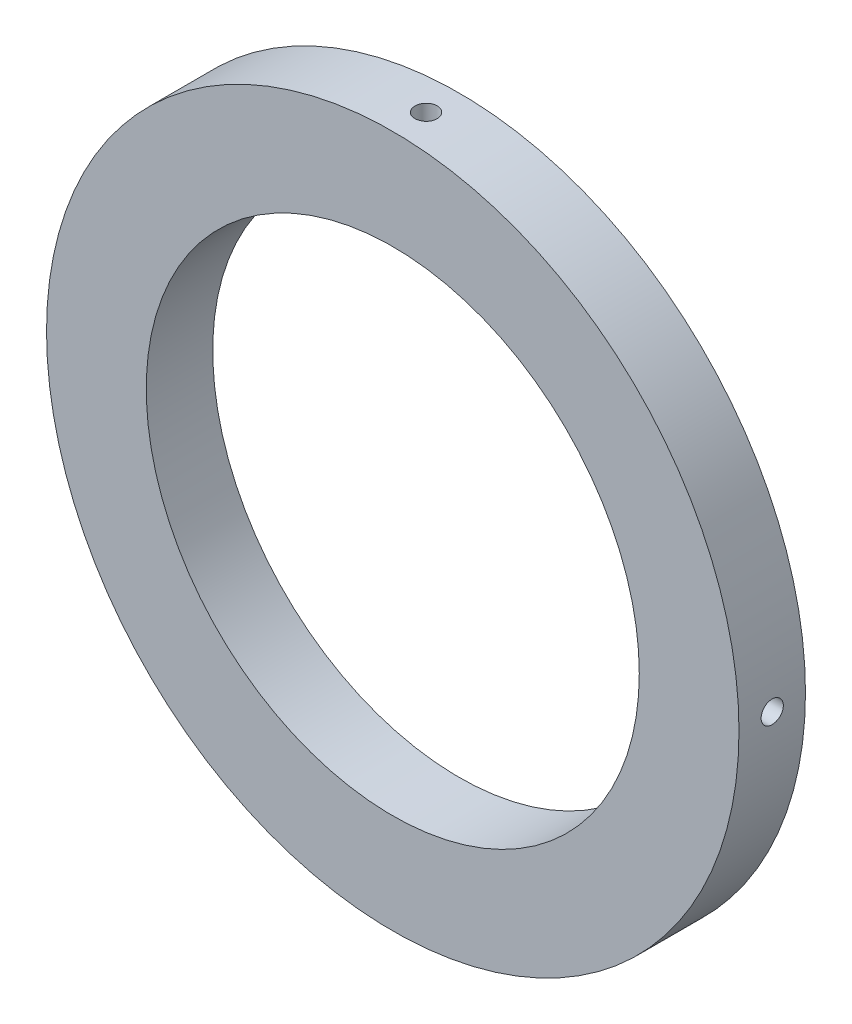
ISO-10303-21;
HEADER;
FILE_DESCRIPTION(('STEP AP214'),'2;1');
FILE_NAME('part.step','',(''),(''),'','','');
FILE_SCHEMA(('AUTOMOTIVE_DESIGN { 1 0 10303 214 1 1 1 1 }'));
ENDSEC;
DATA;
#1=APPLICATION_CONTEXT('core data for automotive mechanical design processes');
#2=APPLICATION_PROTOCOL_DEFINITION('international standard','automotive_design',2000,#1);
#3=PRODUCT_CONTEXT('',#1,'mechanical');
#4=PRODUCT('Part','Part','',(#3));
#5=PRODUCT_RELATED_PRODUCT_CATEGORY('part','',(#4));
#6=PRODUCT_DEFINITION_FORMATION('','',#4);
#7=PRODUCT_DEFINITION_CONTEXT('part definition',#1,'design');
#8=PRODUCT_DEFINITION('design','',#6,#7);
#9=PRODUCT_DEFINITION_SHAPE('','',#8);
#10=(LENGTH_UNIT() NAMED_UNIT(*) SI_UNIT(.MILLI.,.METRE.));
#11=(NAMED_UNIT(*) PLANE_ANGLE_UNIT() SI_UNIT($,.RADIAN.));
#12=(NAMED_UNIT(*) SI_UNIT($,.STERADIAN.) SOLID_ANGLE_UNIT());
#13=UNCERTAINTY_MEASURE_WITH_UNIT(LENGTH_MEASURE(1.E-05),#10,'distance_accuracy_value','');
#14=(GEOMETRIC_REPRESENTATION_CONTEXT(3) GLOBAL_UNCERTAINTY_ASSIGNED_CONTEXT((#13)) GLOBAL_UNIT_ASSIGNED_CONTEXT((#10,
#11,#12)) REPRESENTATION_CONTEXT('',''));
#15=CARTESIAN_POINT('',(0.,0.,0.));
#16=DIRECTION('',(0.,0.,1.));
#17=DIRECTION('',(1.,0.,0.));
#18=AXIS2_PLACEMENT_3D('',#15,#16,#17);
#19=CARTESIAN_POINT('',(0.,0.,6.));
#20=DIRECTION('',(0.,0.,-1.));
#21=DIRECTION('',(-1.,0.,0.));
#22=AXIS2_PLACEMENT_3D('',#19,#20,#21);
#23=CYLINDRICAL_SURFACE('',#22,62.5);
#24=CARTESIAN_POINT('',(-62.5,0.,2.));
#25=CARTESIAN_POINT('',(-62.4999995691048,-0.11231003332482,1.9999950289741));
#26=CARTESIAN_POINT('',(-62.4996940278379,-0.224700769959252,1.99050808679491));
#27=CARTESIAN_POINT('',(-62.4985045360078,-0.446384828450461,1.95279562582615));
#28=CARTESIAN_POINT('',(-62.4976198952782,-0.555674291875496,1.92454774731149));
#29=CARTESIAN_POINT('',(-62.4953723833313,-0.76791221481031,1.85012028682134));
#30=CARTESIAN_POINT('',(-62.4940097468506,-0.870863757661421,1.80394950533588));
#31=CARTESIAN_POINT('',(-62.4909599274924,-1.06752616621898,1.69499955155458));
#32=CARTESIAN_POINT('',(-62.4892728236653,-1.16123927430315,1.63222442320268));
#33=CARTESIAN_POINT('',(-62.4857630801216,-1.33684016007617,1.4918112906154));
#34=CARTESIAN_POINT('',(-62.4839403832154,-1.41872290470148,1.41416699297466));
#35=CARTESIAN_POINT('',(-62.4803653858262,-1.56829629148627,1.24623078210407));
#36=CARTESIAN_POINT('',(-62.4786130881545,-1.63598636731638,1.15593836441663));
#37=CARTESIAN_POINT('',(-62.4753761886423,-1.75526175390508,0.965249081508573));
#38=CARTESIAN_POINT('',(-62.4738916393946,-1.80684390209016,0.864850237138202));
#39=CARTESIAN_POINT('',(-62.4713581958304,-1.89241867681929,0.656812134178371));
#40=CARTESIAN_POINT('',(-62.470309299646,-1.92641137878248,0.549172906636092));
#41=CARTESIAN_POINT('',(-62.4687658666881,-1.97583112734589,0.329748833268305));
#42=CARTESIAN_POINT('',(-62.4682711387342,-1.99126457676676,0.217965430883288));
#43=CARTESIAN_POINT('',(-62.4678912506535,-2.00314744915503,-0.00660657213354373));
#44=CARTESIAN_POINT('',(-62.4680060879093,-1.99959695363795,-0.119395168447062));
#45=CARTESIAN_POINT('',(-62.4688322022814,-1.97361812403031,-0.3427324635363));
#46=CARTESIAN_POINT('',(-62.4695432607447,-1.95119671048448,-0.453281968237548));
#47=CARTESIAN_POINT('',(-62.4714813170102,-1.88812321347998,-0.669047092889274));
#48=CARTESIAN_POINT('',(-62.4727083160294,-1.84747108701891,-0.774262700257559));
#49=CARTESIAN_POINT('',(-62.4755401891637,-1.74908219078789,-0.9763956103056));
#50=CARTESIAN_POINT('',(-62.4771451333974,-1.69134225027881,-1.07331136859498));
#51=CARTESIAN_POINT('',(-62.4805519008691,-1.56041910396509,-1.25607655423932));
#52=CARTESIAN_POINT('',(-62.4823537246298,-1.48723585715829,-1.34192595221199));
#53=CARTESIAN_POINT('',(-62.4859521079271,-1.3274643627619,-1.50016177945304));
#54=CARTESIAN_POINT('',(-62.4877486647386,-1.24087011489895,-1.57254215041678));
#55=CARTESIAN_POINT('',(-62.4911332105912,-1.05675587699624,-1.70173865632043));
#56=CARTESIAN_POINT('',(-62.4927211995972,-0.959235885128259,-1.75855478865595));
#57=CARTESIAN_POINT('',(-62.4955096291705,-0.756035024789911,-1.8550093391255));
#58=CARTESIAN_POINT('',(-62.4967100654035,-0.650354065067295,-1.89464756515117));
#59=CARTESIAN_POINT('',(-62.4985880024256,-0.433832697452574,-1.9556172392457));
#60=CARTESIAN_POINT('',(-62.4992655048312,-0.32299230550992,-1.97694874390251));
#61=CARTESIAN_POINT('',(-62.5000209974192,-0.0993510779584291,-2.00069202279605));
#62=CARTESIAN_POINT('',(-62.5000992532154,0.0134488668623008,-2.00311217942155));
#63=CARTESIAN_POINT('',(-62.4996481351289,0.237853441492163,-1.98898590928016));
#64=CARTESIAN_POINT('',(-62.4991187620512,0.349458072884912,-1.97243950764435));
#65=CARTESIAN_POINT('',(-62.4975122155884,0.568280581329863,-1.92085675170576));
#66=CARTESIAN_POINT('',(-62.4964351550129,0.675499356844618,-1.88582420502076));
#67=CARTESIAN_POINT('',(-62.4938545937676,0.882534185428098,-1.79826747151954));
#68=CARTESIAN_POINT('',(-62.4923510921167,0.982350221463125,-1.7457432444565));
#69=CARTESIAN_POINT('',(-62.489086340168,1.17178472574769,-1.62467255048254));
#70=CARTESIAN_POINT('',(-62.4873249992276,1.26139958803169,-1.55612044393968));
#71=CARTESIAN_POINT('',(-62.4837433630355,1.42785168383287,-1.40494821395652));
#72=CARTESIAN_POINT('',(-62.4819230676156,1.50468888089511,-1.32232805038111));
#73=CARTESIAN_POINT('',(-62.4784279707888,1.64343252244242,-1.14532906345293));
#74=CARTESIAN_POINT('',(-62.4767532222403,1.70533355693563,-1.05094599820289));
#75=CARTESIAN_POINT('',(-62.4737388738995,1.81241074122226,-0.853122029147493));
#76=CARTESIAN_POINT('',(-62.4723992732974,1.85758693143224,-0.749681147231634));
#77=CARTESIAN_POINT('',(-62.4702066376182,1.92992256506237,-0.536698195906036));
#78=CARTESIAN_POINT('',(-62.4693535081147,1.95708550510527,-0.427157315068665));
#79=CARTESIAN_POINT('',(-62.4682297389501,1.99263504229854,-0.205067010164371));
#80=CARTESIAN_POINT('',(-62.4679590985605,2.00102166293039,-0.092517589860075));
#81=CARTESIAN_POINT('',(-62.4680308558449,1.99878009628648,0.132340817523504));
#82=CARTESIAN_POINT('',(-62.4683729785305,1.9881604384219,0.244649889819214));
#83=CARTESIAN_POINT('',(-62.4696311162344,1.94822531924438,0.465890163127914));
#84=CARTESIAN_POINT('',(-62.4705471323877,1.91890982095921,0.574821357460483));
#85=CARTESIAN_POINT('',(-62.4728497507852,1.8424164469434,0.786216741342344));
#86=CARTESIAN_POINT('',(-62.4742363606753,1.79523828098828,0.88868082578542));
#87=CARTESIAN_POINT('',(-62.4773237964511,1.6843614549507,1.08423216714658));
#88=CARTESIAN_POINT('',(-62.479024611107,1.62066338525739,1.1773197589972));
#89=CARTESIAN_POINT('',(-62.4825495142681,1.47852878356106,1.35151552679399));
#90=CARTESIAN_POINT('',(-62.4843736447435,1.40008721730535,1.4326195939504));
#91=CARTESIAN_POINT('',(-62.4879395737552,1.23067860467564,1.58053011850308));
#92=CARTESIAN_POINT('',(-62.4896813518036,1.13970846321673,1.64733303246385));
#93=CARTESIAN_POINT('',(-62.4928868889546,0.947786672192984,1.76475783281649));
#94=CARTESIAN_POINT('',(-62.4943504604447,0.846828356237342,1.81536881555901));
#95=CARTESIAN_POINT('',(-62.4968313107122,0.637920632646016,1.89886333802007));
#96=CARTESIAN_POINT('',(-62.4978491210192,0.529979728435139,1.93176800168585));
#97=CARTESIAN_POINT('',(-62.4990519563076,0.351131529826547,1.97020270096496));
#98=CARTESIAN_POINT('',(-62.4994059285874,0.281384922933388,1.98136261230068));
#99=CARTESIAN_POINT('',(-62.4998800857657,0.141102830908638,1.99626282228382));
#100=CARTESIAN_POINT('',(-62.5000002707428,0.0705673460423312,2.00000312342624));
#101=CARTESIAN_POINT('',(-62.5,0.,2.));
#102=B_SPLINE_CURVE_WITH_KNOTS('',3,(#24,#25,#26,#27,#28,#29,#30,#31,#32,#33,#34,#35,#36,#37,
#38,#39,#40,#41,#42,#43,#44,#45,#46,#47,#48,#49,#50,#51,#52,#53,#54,#55,#56,#57,#58,#59,#60,#61,
#62,#63,#64,#65,#66,#67,#68,#69,#70,#71,#72,#73,#74,#75,#76,#77,#78,#79,#80,#81,#82,#83,#84,#85,
#86,#87,#88,#89,#90,#91,#92,#93,#94,#95,#96,#97,#98,#99,#100,#101),.UNSPECIFIED.,.T.,.F.,(4,2,2,
2,2,2,2,2,2,2,2,2,2,2,2,2,2,2,2,2,2,2,2,2,2,2,2,2,2,2,2,2,2,2,2,2,2,2,4),(0.,0.336672518670816,
0.673747013347549,1.01065620689366,1.34748342254514,1.68445351733391,2.02143705566592,
2.35848671461609,2.69553492836994,3.03246682930634,3.36939728348592,3.70620422874169,
4.04301196845831,4.37988224395508,4.71675341385757,5.05377574249107,5.39079812751915,
5.72782428152482,6.0648493937443,6.40172511228489,6.73860038445866,7.07540629701787,
7.41221298454317,7.74913836100434,8.08606469870433,8.42311289111117,8.76016026901621,
9.09714220216487,9.43412371388713,9.77095403697969,10.1077850261783,10.4446214882882,
10.7814459141778,11.1183855603567,11.4554085946085,11.792658104853,12.1295043734805,
12.3410446376387,12.552584830662),.UNSPECIFIED.);
#103=CARTESIAN_POINT('',(-62.5,0.,2.));
#104=VERTEX_POINT('',#103);
#105=EDGE_CURVE('E34',#104,#104,#102,.T.);
#106=ORIENTED_EDGE('',*,*,#105,.T.);
#107=EDGE_LOOP('',(#106));
#108=FACE_BOUND('',#107,.T.);
#109=CARTESIAN_POINT('',(0.,-62.5,2.));
#110=CARTESIAN_POINT('',(0.11231003332482,-62.4999995691048,1.9999950289741));
#111=CARTESIAN_POINT('',(0.224700769959253,-62.4996940278379,1.99050808679491));
#112=CARTESIAN_POINT('',(0.446384828450461,-62.4985045360078,1.95279562582615));
#113=CARTESIAN_POINT('',(0.555674291875497,-62.4976198952782,1.92454774731149));
#114=CARTESIAN_POINT('',(0.76791221481031,-62.4953723833313,1.85012028682134));
#115=CARTESIAN_POINT('',(0.870863757661422,-62.4940097468506,1.80394950533588));
#116=CARTESIAN_POINT('',(1.06752616621898,-62.4909599274924,1.69499955155458));
#117=CARTESIAN_POINT('',(1.16123927430315,-62.4892728236653,1.63222442320268));
#118=CARTESIAN_POINT('',(1.33684016007617,-62.4857630801216,1.4918112906154));
#119=CARTESIAN_POINT('',(1.41872290470148,-62.4839403832154,1.41416699297466));
#120=CARTESIAN_POINT('',(1.56829629148627,-62.4803653858262,1.24623078210407));
#121=CARTESIAN_POINT('',(1.63598636731638,-62.4786130881545,1.15593836441663));
#122=CARTESIAN_POINT('',(1.75526175390508,-62.4753761886423,0.965249081508572));
#123=CARTESIAN_POINT('',(1.80684390209016,-62.4738916393946,0.864850237138202));
#124=CARTESIAN_POINT('',(1.8924186768193,-62.4713581958304,0.65681213417837));
#125=CARTESIAN_POINT('',(1.92641137878248,-62.470309299646,0.549172906636091));
#126=CARTESIAN_POINT('',(1.97583112734589,-62.4687658666881,0.329748833268303));
#127=CARTESIAN_POINT('',(1.99126457676676,-62.4682711387342,0.217965430883287));
#128=CARTESIAN_POINT('',(2.00314744915503,-62.4678912506536,-0.00660657213354471));
#129=CARTESIAN_POINT('',(1.99959695363795,-62.4680060879093,-0.119395168447063));
#130=CARTESIAN_POINT('',(1.97361812403031,-62.4688322022814,-0.3427324635363));
#131=CARTESIAN_POINT('',(1.95119671048448,-62.4695432607447,-0.453281968237548));
#132=CARTESIAN_POINT('',(1.88812321347998,-62.4714813170102,-0.669047092889274));
#133=CARTESIAN_POINT('',(1.84747108701891,-62.4727083160294,-0.77426270025756));
#134=CARTESIAN_POINT('',(1.74908219078789,-62.4755401891637,-0.9763956103056));
#135=CARTESIAN_POINT('',(1.69134225027881,-62.4771451333974,-1.07331136859498));
#136=CARTESIAN_POINT('',(1.56041910396509,-62.4805519008691,-1.25607655423932));
#137=CARTESIAN_POINT('',(1.48723585715829,-62.4823537246298,-1.34192595221199));
#138=CARTESIAN_POINT('',(1.3274643627619,-62.4859521079271,-1.50016177945304));
#139=CARTESIAN_POINT('',(1.24087011489895,-62.4877486647386,-1.57254215041678));
#140=CARTESIAN_POINT('',(1.05675587699624,-62.4911332105912,-1.70173865632043));
#141=CARTESIAN_POINT('',(0.959235885128259,-62.4927211995972,-1.75855478865595));
#142=CARTESIAN_POINT('',(0.756035024789911,-62.4955096291705,-1.8550093391255));
#143=CARTESIAN_POINT('',(0.650354065067294,-62.4967100654035,-1.89464756515117));
#144=CARTESIAN_POINT('',(0.433832697452573,-62.4985880024256,-1.9556172392457));
#145=CARTESIAN_POINT('',(0.322992305509919,-62.4992655048312,-1.97694874390251));
#146=CARTESIAN_POINT('',(0.099351077958428,-62.5000209974192,-2.00069202279605));
#147=CARTESIAN_POINT('',(-0.0134488668623019,-62.5000992532154,-2.00311217942155));
#148=CARTESIAN_POINT('',(-0.237853441492164,-62.4996481351289,-1.98898590928016));
#149=CARTESIAN_POINT('',(-0.349458072884913,-62.4991187620512,-1.97243950764436));
#150=CARTESIAN_POINT('',(-0.568280581329864,-62.4975122155884,-1.92085675170576));
#151=CARTESIAN_POINT('',(-0.675499356844619,-62.4964351550129,-1.88582420502076));
#152=CARTESIAN_POINT('',(-0.882534185428099,-62.4938545937676,-1.79826747151954));
#153=CARTESIAN_POINT('',(-0.982350221463126,-62.4923510921167,-1.7457432444565));
#154=CARTESIAN_POINT('',(-1.17178472574769,-62.489086340168,-1.62467255048254));
#155=CARTESIAN_POINT('',(-1.26139958803169,-62.4873249992276,-1.55612044393968));
#156=CARTESIAN_POINT('',(-1.42785168383287,-62.4837433630355,-1.40494821395652));
#157=CARTESIAN_POINT('',(-1.50468888089512,-62.4819230676156,-1.32232805038111));
#158=CARTESIAN_POINT('',(-1.64343252244242,-62.4784279707888,-1.14532906345293));
#159=CARTESIAN_POINT('',(-1.70533355693563,-62.4767532222403,-1.05094599820288));
#160=CARTESIAN_POINT('',(-1.81241074122226,-62.4737388738995,-0.853122029147492));
#161=CARTESIAN_POINT('',(-1.85758693143224,-62.4723992732974,-0.749681147231633));
#162=CARTESIAN_POINT('',(-1.92992256506237,-62.4702066376182,-0.536698195906035));
#163=CARTESIAN_POINT('',(-1.95708550510527,-62.4693535081147,-0.427157315068664));
#164=CARTESIAN_POINT('',(-1.99263504229854,-62.4682297389501,-0.20506701016437));
#165=CARTESIAN_POINT('',(-2.00102166293039,-62.4679590985605,-0.0925175898600738));
#166=CARTESIAN_POINT('',(-1.99878009628648,-62.4680308558449,0.132340817523506));
#167=CARTESIAN_POINT('',(-1.9881604384219,-62.4683729785305,0.244649889819216));
#168=CARTESIAN_POINT('',(-1.94822531924438,-62.4696311162344,0.465890163127916));
#169=CARTESIAN_POINT('',(-1.91890982095921,-62.4705471323877,0.574821357460485));
#170=CARTESIAN_POINT('',(-1.8424164469434,-62.4728497507852,0.786216741342345));
#171=CARTESIAN_POINT('',(-1.79523828098828,-62.4742363606753,0.888680825785421));
#172=CARTESIAN_POINT('',(-1.6843614549507,-62.4773237964511,1.08423216714658));
#173=CARTESIAN_POINT('',(-1.62066338525739,-62.479024611107,1.1773197589972));
#174=CARTESIAN_POINT('',(-1.47852878356106,-62.4825495142681,1.35151552679399));
#175=CARTESIAN_POINT('',(-1.40008721730535,-62.4843736447435,1.4326195939504));
#176=CARTESIAN_POINT('',(-1.23067860467564,-62.4879395737552,1.58053011850309));
#177=CARTESIAN_POINT('',(-1.13970846321673,-62.4896813518036,1.64733303246385));
#178=CARTESIAN_POINT('',(-0.947786672192983,-62.4928868889546,1.76475783281649));
#179=CARTESIAN_POINT('',(-0.846828356237341,-62.4943504604447,1.81536881555901));
#180=CARTESIAN_POINT('',(-0.637920632646014,-62.4968313107122,1.89886333802007));
#181=CARTESIAN_POINT('',(-0.529979728435138,-62.4978491210192,1.93176800168585));
#182=CARTESIAN_POINT('',(-0.351131529826545,-62.4990519563076,1.97020270096496));
#183=CARTESIAN_POINT('',(-0.281384922933387,-62.4994059285874,1.98136261230068));
#184=CARTESIAN_POINT('',(-0.141102830908637,-62.4998800857657,1.99626282228382));
#185=CARTESIAN_POINT('',(-0.0705673460423306,-62.5000002707428,2.00000312342624));
#186=CARTESIAN_POINT('',(0.,-62.5,2.));
#187=B_SPLINE_CURVE_WITH_KNOTS('',3,(#109,#110,#111,#112,#113,#114,#115,#116,#117,#118,#119,
#120,#121,#122,#123,#124,#125,#126,#127,#128,#129,#130,#131,#132,#133,#134,#135,#136,#137,#138,
#139,#140,#141,#142,#143,#144,#145,#146,#147,#148,#149,#150,#151,#152,#153,#154,#155,#156,#157,
#158,#159,#160,#161,#162,#163,#164,#165,#166,#167,#168,#169,#170,#171,#172,#173,#174,#175,#176,
#177,#178,#179,#180,#181,#182,#183,#184,#185,#186),.UNSPECIFIED.,.T.,.F.,(4,2,2,2,2,2,2,2,2,2,2,
2,2,2,2,2,2,2,2,2,2,2,2,2,2,2,2,2,2,2,2,2,2,2,2,2,2,2,4),(0.,0.336672518670817,
0.673747013347549,1.01065620689366,1.34748342254514,1.68445351733391,2.02143705566592,
2.35848671461609,2.69553492836994,3.03246682930634,3.36939728348592,3.70620422874169,
4.04301196845831,4.37988224395508,4.71675341385757,5.05377574249107,5.39079812751915,
5.72782428152482,6.06484939374431,6.40172511228489,6.73860038445866,7.07540629701787,
7.41221298454317,7.74913836100434,8.08606469870433,8.42311289111117,8.76016026901621,
9.09714220216487,9.43412371388713,9.7709540369797,10.1077850261783,10.4446214882882,
10.7814459141778,11.1183855603567,11.4554085946085,11.7926581048531,12.1295043734805,
12.3410446376387,12.552584830662),.UNSPECIFIED.);
#188=CARTESIAN_POINT('',(0.,-62.5,2.));
#189=VERTEX_POINT('',#188);
#190=EDGE_CURVE('E61',#189,#189,#187,.T.);
#191=ORIENTED_EDGE('',*,*,#190,.T.);
#192=EDGE_LOOP('',(#191));
#193=FACE_BOUND('',#192,.T.);
#194=CARTESIAN_POINT('',(0.,0.,6.));
#195=DIRECTION('',(0.,0.,1.));
#196=DIRECTION('',(1.,0.,0.));
#197=AXIS2_PLACEMENT_3D('',#194,#195,#196);
#198=CIRCLE('',#197,62.5);
#199=CARTESIAN_POINT('',(62.5,0.,6.));
#200=VERTEX_POINT('',#199);
#201=EDGE_CURVE('E10',#200,#200,#198,.T.);
#202=ORIENTED_EDGE('',*,*,#201,.F.);
#203=EDGE_LOOP('',(#202));
#204=FACE_BOUND('',#203,.T.);
#205=CARTESIAN_POINT('',(0.,0.,-6.));
#206=DIRECTION('',(0.,0.,1.));
#207=DIRECTION('',(1.,0.,0.));
#208=AXIS2_PLACEMENT_3D('',#205,#206,#207);
#209=CIRCLE('',#208,62.5);
#210=CARTESIAN_POINT('',(62.5,0.,-6.));
#211=VERTEX_POINT('',#210);
#212=EDGE_CURVE('E42',#211,#211,#209,.T.);
#213=ORIENTED_EDGE('',*,*,#212,.T.);
#214=EDGE_LOOP('',(#213));
#215=FACE_BOUND('',#214,.T.);
#216=CARTESIAN_POINT('',(0.,62.5,-2.));
#217=CARTESIAN_POINT('',(-0.11231003332482,62.4999995691048,-1.9999950289741));
#218=CARTESIAN_POINT('',(-0.224700769959253,62.4996940278379,-1.99050808679491));
#219=CARTESIAN_POINT('',(-0.446384828450461,62.4985045360078,-1.95279562582615));
#220=CARTESIAN_POINT('',(-0.555674291875497,62.4976198952782,-1.92454774731149));
#221=CARTESIAN_POINT('',(-0.76791221481031,62.4953723833313,-1.85012028682134));
#222=CARTESIAN_POINT('',(-0.870863757661422,62.4940097468506,-1.80394950533588));
#223=CARTESIAN_POINT('',(-1.06752616621898,62.4909599274924,-1.69499955155458));
#224=CARTESIAN_POINT('',(-1.16123927430315,62.4892728236653,-1.63222442320268));
#225=CARTESIAN_POINT('',(-1.33684016007617,62.4857630801216,-1.4918112906154));
#226=CARTESIAN_POINT('',(-1.41872290470148,62.4839403832154,-1.41416699297466));
#227=CARTESIAN_POINT('',(-1.56829629148627,62.4803653858262,-1.24623078210407));
#228=CARTESIAN_POINT('',(-1.63598636731638,62.4786130881545,-1.15593836441663));
#229=CARTESIAN_POINT('',(-1.75526175390508,62.4753761886423,-0.965249081508572));
#230=CARTESIAN_POINT('',(-1.80684390209016,62.4738916393946,-0.864850237138202));
#231=CARTESIAN_POINT('',(-1.8924186768193,62.4713581958304,-0.65681213417837));
#232=CARTESIAN_POINT('',(-1.92641137878248,62.470309299646,-0.549172906636091));
#233=CARTESIAN_POINT('',(-1.97583112734589,62.4687658666881,-0.329748833268303));
#234=CARTESIAN_POINT('',(-1.99126457676676,62.4682711387342,-0.217965430883287));
#235=CARTESIAN_POINT('',(-2.00314744915503,62.4678912506536,0.00660657213354471));
#236=CARTESIAN_POINT('',(-1.99959695363795,62.4680060879093,0.119395168447063));
#237=CARTESIAN_POINT('',(-1.97361812403031,62.4688322022814,0.3427324635363));
#238=CARTESIAN_POINT('',(-1.95119671048448,62.4695432607447,0.453281968237548));
#239=CARTESIAN_POINT('',(-1.88812321347998,62.4714813170102,0.669047092889274));
#240=CARTESIAN_POINT('',(-1.84747108701891,62.4727083160294,0.77426270025756));
#241=CARTESIAN_POINT('',(-1.74908219078789,62.4755401891637,0.9763956103056));
#242=CARTESIAN_POINT('',(-1.69134225027881,62.4771451333974,1.07331136859498));
#243=CARTESIAN_POINT('',(-1.56041910396509,62.4805519008691,1.25607655423932));
#244=CARTESIAN_POINT('',(-1.48723585715829,62.4823537246298,1.34192595221199));
#245=CARTESIAN_POINT('',(-1.3274643627619,62.4859521079271,1.50016177945304));
#246=CARTESIAN_POINT('',(-1.24087011489895,62.4877486647386,1.57254215041678));
#247=CARTESIAN_POINT('',(-1.05675587699624,62.4911332105912,1.70173865632043));
#248=CARTESIAN_POINT('',(-0.959235885128259,62.4927211995972,1.75855478865595));
#249=CARTESIAN_POINT('',(-0.756035024789911,62.4955096291705,1.8550093391255));
#250=CARTESIAN_POINT('',(-0.650354065067294,62.4967100654035,1.89464756515117));
#251=CARTESIAN_POINT('',(-0.433832697452573,62.4985880024256,1.9556172392457));
#252=CARTESIAN_POINT('',(-0.322992305509919,62.4992655048312,1.97694874390251));
#253=CARTESIAN_POINT('',(-0.099351077958428,62.5000209974192,2.00069202279605));
#254=CARTESIAN_POINT('',(0.0134488668623019,62.5000992532154,2.00311217942155));
#255=CARTESIAN_POINT('',(0.237853441492164,62.4996481351289,1.98898590928016));
#256=CARTESIAN_POINT('',(0.349458072884913,62.4991187620512,1.97243950764436));
#257=CARTESIAN_POINT('',(0.568280581329864,62.4975122155884,1.92085675170576));
#258=CARTESIAN_POINT('',(0.675499356844619,62.4964351550129,1.88582420502076));
#259=CARTESIAN_POINT('',(0.882534185428099,62.4938545937676,1.79826747151954));
#260=CARTESIAN_POINT('',(0.982350221463126,62.4923510921167,1.7457432444565));
#261=CARTESIAN_POINT('',(1.17178472574769,62.489086340168,1.62467255048254));
#262=CARTESIAN_POINT('',(1.26139958803169,62.4873249992276,1.55612044393968));
#263=CARTESIAN_POINT('',(1.42785168383287,62.4837433630355,1.40494821395652));
#264=CARTESIAN_POINT('',(1.50468888089512,62.4819230676156,1.32232805038111));
#265=CARTESIAN_POINT('',(1.64343252244242,62.4784279707888,1.14532906345293));
#266=CARTESIAN_POINT('',(1.70533355693563,62.4767532222403,1.05094599820288));
#267=CARTESIAN_POINT('',(1.81241074122226,62.4737388738995,0.853122029147492));
#268=CARTESIAN_POINT('',(1.85758693143224,62.4723992732974,0.749681147231633));
#269=CARTESIAN_POINT('',(1.92992256506237,62.4702066376182,0.536698195906035));
#270=CARTESIAN_POINT('',(1.95708550510527,62.4693535081147,0.427157315068664));
#271=CARTESIAN_POINT('',(1.99263504229854,62.4682297389501,0.20506701016437));
#272=CARTESIAN_POINT('',(2.00102166293039,62.4679590985605,0.0925175898600738));
#273=CARTESIAN_POINT('',(1.99878009628648,62.4680308558449,-0.132340817523506));
#274=CARTESIAN_POINT('',(1.9881604384219,62.4683729785305,-0.244649889819216));
#275=CARTESIAN_POINT('',(1.94822531924438,62.4696311162344,-0.465890163127916));
#276=CARTESIAN_POINT('',(1.91890982095921,62.4705471323877,-0.574821357460485));
#277=CARTESIAN_POINT('',(1.8424164469434,62.4728497507852,-0.786216741342345));
#278=CARTESIAN_POINT('',(1.79523828098828,62.4742363606753,-0.888680825785421));
#279=CARTESIAN_POINT('',(1.6843614549507,62.4773237964511,-1.08423216714658));
#280=CARTESIAN_POINT('',(1.62066338525739,62.479024611107,-1.1773197589972));
#281=CARTESIAN_POINT('',(1.47852878356106,62.4825495142681,-1.35151552679399));
#282=CARTESIAN_POINT('',(1.40008721730535,62.4843736447435,-1.4326195939504));
#283=CARTESIAN_POINT('',(1.23067860467564,62.4879395737552,-1.58053011850309));
#284=CARTESIAN_POINT('',(1.13970846321673,62.4896813518036,-1.64733303246385));
#285=CARTESIAN_POINT('',(0.947786672192983,62.4928868889546,-1.76475783281649));
#286=CARTESIAN_POINT('',(0.846828356237341,62.4943504604447,-1.81536881555901));
#287=CARTESIAN_POINT('',(0.637920632646014,62.4968313107122,-1.89886333802007));
#288=CARTESIAN_POINT('',(0.529979728435138,62.4978491210192,-1.93176800168585));
#289=CARTESIAN_POINT('',(0.351131529826545,62.4990519563076,-1.97020270096496));
#290=CARTESIAN_POINT('',(0.281384922933387,62.4994059285874,-1.98136261230068));
#291=CARTESIAN_POINT('',(0.141102830908637,62.4998800857657,-1.99626282228382));
#292=CARTESIAN_POINT('',(0.0705673460423306,62.5000002707428,-2.00000312342624));
#293=CARTESIAN_POINT('',(0.,62.5,-2.));
#294=B_SPLINE_CURVE_WITH_KNOTS('',3,(#216,#217,#218,#219,#220,#221,#222,#223,#224,#225,#226,
#227,#228,#229,#230,#231,#232,#233,#234,#235,#236,#237,#238,#239,#240,#241,#242,#243,#244,#245,
#246,#247,#248,#249,#250,#251,#252,#253,#254,#255,#256,#257,#258,#259,#260,#261,#262,#263,#264,
#265,#266,#267,#268,#269,#270,#271,#272,#273,#274,#275,#276,#277,#278,#279,#280,#281,#282,#283,
#284,#285,#286,#287,#288,#289,#290,#291,#292,#293),.UNSPECIFIED.,.T.,.F.,(4,2,2,2,2,2,2,2,2,2,2,
2,2,2,2,2,2,2,2,2,2,2,2,2,2,2,2,2,2,2,2,2,2,2,2,2,2,2,4),(0.,0.336672518670817,
0.673747013347549,1.01065620689366,1.34748342254514,1.68445351733391,2.02143705566592,
2.35848671461609,2.69553492836994,3.03246682930634,3.36939728348592,3.70620422874169,
4.04301196845831,4.37988224395508,4.71675341385757,5.05377574249107,5.39079812751915,
5.72782428152482,6.06484939374431,6.40172511228489,6.73860038445866,7.07540629701787,
7.41221298454317,7.74913836100434,8.08606469870433,8.42311289111117,8.76016026901621,
9.09714220216487,9.43412371388713,9.7709540369797,10.1077850261783,10.4446214882882,
10.7814459141778,11.1183855603567,11.4554085946085,11.7926581048531,12.1295043734805,
12.3410446376387,12.552584830662),.UNSPECIFIED.);
#295=CARTESIAN_POINT('',(0.,62.5,-2.));
#296=VERTEX_POINT('',#295);
#297=EDGE_CURVE('E53',#296,#296,#294,.T.);
#298=ORIENTED_EDGE('',*,*,#297,.F.);
#299=EDGE_LOOP('',(#298));
#300=FACE_BOUND('',#299,.T.);
#301=CARTESIAN_POINT('',(62.5,0.,2.));
#302=CARTESIAN_POINT('',(62.4999995691048,-0.11231003332482,1.9999950289741));
#303=CARTESIAN_POINT('',(62.4996940278379,-0.224700769959252,1.99050808679491));
#304=CARTESIAN_POINT('',(62.4985045360078,-0.446384828450461,1.95279562582615));
#305=CARTESIAN_POINT('',(62.4976198952782,-0.555674291875496,1.92454774731149));
#306=CARTESIAN_POINT('',(62.4953723833313,-0.76791221481031,1.85012028682134));
#307=CARTESIAN_POINT('',(62.4940097468506,-0.870863757661421,1.80394950533588));
#308=CARTESIAN_POINT('',(62.4909599274924,-1.06752616621898,1.69499955155458));
#309=CARTESIAN_POINT('',(62.4892728236653,-1.16123927430315,1.63222442320268));
#310=CARTESIAN_POINT('',(62.4857630801216,-1.33684016007617,1.4918112906154));
#311=CARTESIAN_POINT('',(62.4839403832154,-1.41872290470148,1.41416699297466));
#312=CARTESIAN_POINT('',(62.4803653858262,-1.56829629148627,1.24623078210407));
#313=CARTESIAN_POINT('',(62.4786130881545,-1.63598636731638,1.15593836441663));
#314=CARTESIAN_POINT('',(62.4753761886423,-1.75526175390508,0.965249081508573));
#315=CARTESIAN_POINT('',(62.4738916393946,-1.80684390209016,0.864850237138202));
#316=CARTESIAN_POINT('',(62.4713581958304,-1.89241867681929,0.656812134178371));
#317=CARTESIAN_POINT('',(62.470309299646,-1.92641137878248,0.549172906636092));
#318=CARTESIAN_POINT('',(62.4687658666881,-1.97583112734589,0.329748833268305));
#319=CARTESIAN_POINT('',(62.4682711387342,-1.99126457676676,0.217965430883288));
#320=CARTESIAN_POINT('',(62.4678912506535,-2.00314744915503,-0.00660657213354373));
#321=CARTESIAN_POINT('',(62.4680060879093,-1.99959695363795,-0.119395168447062));
#322=CARTESIAN_POINT('',(62.4688322022814,-1.97361812403031,-0.3427324635363));
#323=CARTESIAN_POINT('',(62.4695432607447,-1.95119671048448,-0.453281968237548));
#324=CARTESIAN_POINT('',(62.4714813170102,-1.88812321347998,-0.669047092889274));
#325=CARTESIAN_POINT('',(62.4727083160294,-1.84747108701891,-0.774262700257559));
#326=CARTESIAN_POINT('',(62.4755401891637,-1.74908219078789,-0.9763956103056));
#327=CARTESIAN_POINT('',(62.4771451333974,-1.69134225027881,-1.07331136859498));
#328=CARTESIAN_POINT('',(62.4805519008691,-1.56041910396509,-1.25607655423932));
#329=CARTESIAN_POINT('',(62.4823537246298,-1.48723585715829,-1.34192595221199));
#330=CARTESIAN_POINT('',(62.4859521079271,-1.3274643627619,-1.50016177945304));
#331=CARTESIAN_POINT('',(62.4877486647386,-1.24087011489895,-1.57254215041678));
#332=CARTESIAN_POINT('',(62.4911332105912,-1.05675587699624,-1.70173865632043));
#333=CARTESIAN_POINT('',(62.4927211995972,-0.959235885128259,-1.75855478865595));
#334=CARTESIAN_POINT('',(62.4955096291705,-0.756035024789911,-1.8550093391255));
#335=CARTESIAN_POINT('',(62.4967100654035,-0.650354065067295,-1.89464756515117));
#336=CARTESIAN_POINT('',(62.4985880024256,-0.433832697452574,-1.9556172392457));
#337=CARTESIAN_POINT('',(62.4992655048312,-0.32299230550992,-1.97694874390251));
#338=CARTESIAN_POINT('',(62.5000209974192,-0.0993510779584291,-2.00069202279605));
#339=CARTESIAN_POINT('',(62.5000992532154,0.0134488668623008,-2.00311217942155));
#340=CARTESIAN_POINT('',(62.4996481351289,0.237853441492163,-1.98898590928016));
#341=CARTESIAN_POINT('',(62.4991187620512,0.349458072884912,-1.97243950764435));
#342=CARTESIAN_POINT('',(62.4975122155884,0.568280581329863,-1.92085675170576));
#343=CARTESIAN_POINT('',(62.4964351550129,0.675499356844618,-1.88582420502076));
#344=CARTESIAN_POINT('',(62.4938545937676,0.882534185428098,-1.79826747151954));
#345=CARTESIAN_POINT('',(62.4923510921167,0.982350221463125,-1.7457432444565));
#346=CARTESIAN_POINT('',(62.489086340168,1.17178472574769,-1.62467255048254));
#347=CARTESIAN_POINT('',(62.4873249992276,1.26139958803169,-1.55612044393968));
#348=CARTESIAN_POINT('',(62.4837433630355,1.42785168383287,-1.40494821395652));
#349=CARTESIAN_POINT('',(62.4819230676156,1.50468888089511,-1.32232805038111));
#350=CARTESIAN_POINT('',(62.4784279707888,1.64343252244242,-1.14532906345293));
#351=CARTESIAN_POINT('',(62.4767532222403,1.70533355693563,-1.05094599820289));
#352=CARTESIAN_POINT('',(62.4737388738995,1.81241074122226,-0.853122029147493));
#353=CARTESIAN_POINT('',(62.4723992732974,1.85758693143224,-0.749681147231634));
#354=CARTESIAN_POINT('',(62.4702066376182,1.92992256506237,-0.536698195906036));
#355=CARTESIAN_POINT('',(62.4693535081147,1.95708550510527,-0.427157315068665));
#356=CARTESIAN_POINT('',(62.4682297389501,1.99263504229854,-0.205067010164371));
#357=CARTESIAN_POINT('',(62.4679590985605,2.00102166293039,-0.092517589860075));
#358=CARTESIAN_POINT('',(62.4680308558449,1.99878009628648,0.132340817523504));
#359=CARTESIAN_POINT('',(62.4683729785305,1.9881604384219,0.244649889819214));
#360=CARTESIAN_POINT('',(62.4696311162344,1.94822531924438,0.465890163127914));
#361=CARTESIAN_POINT('',(62.4705471323877,1.91890982095921,0.574821357460483));
#362=CARTESIAN_POINT('',(62.4728497507852,1.8424164469434,0.786216741342344));
#363=CARTESIAN_POINT('',(62.4742363606753,1.79523828098828,0.88868082578542));
#364=CARTESIAN_POINT('',(62.4773237964511,1.6843614549507,1.08423216714658));
#365=CARTESIAN_POINT('',(62.479024611107,1.62066338525739,1.1773197589972));
#366=CARTESIAN_POINT('',(62.4825495142681,1.47852878356106,1.35151552679399));
#367=CARTESIAN_POINT('',(62.4843736447435,1.40008721730535,1.4326195939504));
#368=CARTESIAN_POINT('',(62.4879395737552,1.23067860467564,1.58053011850308));
#369=CARTESIAN_POINT('',(62.4896813518036,1.13970846321673,1.64733303246385));
#370=CARTESIAN_POINT('',(62.4928868889546,0.947786672192984,1.76475783281649));
#371=CARTESIAN_POINT('',(62.4943504604447,0.846828356237342,1.81536881555901));
#372=CARTESIAN_POINT('',(62.4968313107122,0.637920632646016,1.89886333802007));
#373=CARTESIAN_POINT('',(62.4978491210192,0.529979728435139,1.93176800168585));
#374=CARTESIAN_POINT('',(62.4990519563076,0.351131529826547,1.97020270096496));
#375=CARTESIAN_POINT('',(62.4994059285874,0.281384922933388,1.98136261230068));
#376=CARTESIAN_POINT('',(62.4998800857657,0.141102830908638,1.99626282228382));
#377=CARTESIAN_POINT('',(62.5000002707428,0.0705673460423312,2.00000312342624));
#378=CARTESIAN_POINT('',(62.5,0.,2.));
#379=B_SPLINE_CURVE_WITH_KNOTS('',3,(#301,#302,#303,#304,#305,#306,#307,#308,#309,#310,#311,
#312,#313,#314,#315,#316,#317,#318,#319,#320,#321,#322,#323,#324,#325,#326,#327,#328,#329,#330,
#331,#332,#333,#334,#335,#336,#337,#338,#339,#340,#341,#342,#343,#344,#345,#346,#347,#348,#349,
#350,#351,#352,#353,#354,#355,#356,#357,#358,#359,#360,#361,#362,#363,#364,#365,#366,#367,#368,
#369,#370,#371,#372,#373,#374,#375,#376,#377,#378),.UNSPECIFIED.,.T.,.F.,(4,2,2,2,2,2,2,2,2,2,2,
2,2,2,2,2,2,2,2,2,2,2,2,2,2,2,2,2,2,2,2,2,2,2,2,2,2,2,4),(0.,0.336672518670816,
0.673747013347549,1.01065620689366,1.34748342254514,1.68445351733391,2.02143705566592,
2.35848671461609,2.69553492836994,3.03246682930634,3.36939728348592,3.70620422874169,
4.04301196845831,4.37988224395508,4.71675341385757,5.05377574249107,5.39079812751915,
5.72782428152482,6.0648493937443,6.40172511228489,6.73860038445866,7.07540629701787,
7.41221298454317,7.74913836100434,8.08606469870433,8.42311289111117,8.76016026901621,
9.09714220216487,9.43412371388713,9.77095403697969,10.1077850261783,10.4446214882882,
10.7814459141778,11.1183855603567,11.4554085946085,11.792658104853,12.1295043734805,
12.3410446376387,12.552584830662),.UNSPECIFIED.);
#380=CARTESIAN_POINT('',(62.5,0.,2.));
#381=VERTEX_POINT('',#380);
#382=EDGE_CURVE('E102',#381,#381,#379,.T.);
#383=ORIENTED_EDGE('',*,*,#382,.F.);
#384=EDGE_LOOP('',(#383));
#385=FACE_BOUND('',#384,.T.);
#386=ADVANCED_FACE('F30',(#108,#193,#204,#215,#300,#385),#23,.T.);
#387=CARTESIAN_POINT('',(0.,0.,6.));
#388=DIRECTION('',(0.,0.,1.));
#389=DIRECTION('',(1.,0.,0.));
#390=AXIS2_PLACEMENT_3D('',#387,#388,#389);
#391=PLANE('',#390);
#392=ORIENTED_EDGE('',*,*,#201,.T.);
#393=EDGE_LOOP('',(#392));
#394=FACE_BOUND('',#393,.T.);
#395=CARTESIAN_POINT('',(0.,0.,6.));
#396=DIRECTION('',(0.,0.,1.));
#397=DIRECTION('',(1.,0.,0.));
#398=AXIS2_PLACEMENT_3D('',#395,#396,#397);
#399=CIRCLE('',#398,44.5);
#400=CARTESIAN_POINT('',(44.5,0.,6.));
#401=VERTEX_POINT('',#400);
#402=EDGE_CURVE('E47',#401,#401,#399,.T.);
#403=ORIENTED_EDGE('',*,*,#402,.F.);
#404=EDGE_LOOP('',(#403));
#405=FACE_BOUND('',#404,.T.);
#406=ADVANCED_FACE('F78',(#394,#405),#391,.T.);
#407=CARTESIAN_POINT('',(0.,0.,-6.));
#408=DIRECTION('',(0.,0.,1.));
#409=DIRECTION('',(1.,0.,0.));
#410=AXIS2_PLACEMENT_3D('',#407,#408,#409);
#411=PLANE('',#410);
#412=ORIENTED_EDGE('',*,*,#212,.F.);
#413=EDGE_LOOP('',(#412));
#414=FACE_BOUND('',#413,.T.);
#415=CARTESIAN_POINT('',(0.,0.,-6.));
#416=DIRECTION('',(0.,0.,1.));
#417=DIRECTION('',(1.,0.,0.));
#418=AXIS2_PLACEMENT_3D('',#415,#416,#417);
#419=CIRCLE('',#418,44.5);
#420=CARTESIAN_POINT('',(44.5,0.,-6.));
#421=VERTEX_POINT('',#420);
#422=EDGE_CURVE('E50',#421,#421,#419,.T.);
#423=ORIENTED_EDGE('',*,*,#422,.T.);
#424=EDGE_LOOP('',(#423));
#425=FACE_BOUND('',#424,.T.);
#426=ADVANCED_FACE('F76',(#414,#425),#411,.F.);
#427=CARTESIAN_POINT('',(0.,0.,6.));
#428=DIRECTION('',(0.,0.,-1.));
#429=DIRECTION('',(-1.,0.,0.));
#430=AXIS2_PLACEMENT_3D('',#427,#428,#429);
#431=CYLINDRICAL_SURFACE('',#430,44.5);
#432=ORIENTED_EDGE('',*,*,#402,.T.);
#433=EDGE_LOOP('',(#432));
#434=FACE_BOUND('',#433,.T.);
#435=ORIENTED_EDGE('',*,*,#422,.F.);
#436=EDGE_LOOP('',(#435));
#437=FACE_BOUND('',#436,.T.);
#438=ADVANCED_FACE('F72',(#434,#437),#431,.F.);
#439=CARTESIAN_POINT('',(0.,65.,0.));
#440=DIRECTION('',(0.,-1.,0.));
#441=DIRECTION('',(0.,0.,-1.));
#442=AXIS2_PLACEMENT_3D('',#439,#440,#441);
#443=CYLINDRICAL_SURFACE('',#442,2.);
#444=CARTESIAN_POINT('',(0.,55.,0.));
#445=DIRECTION('',(0.,1.,0.));
#446=DIRECTION('',(0.,0.,1.));
#447=AXIS2_PLACEMENT_3D('',#444,#445,#446);
#448=CIRCLE('',#447,2.);
#449=CARTESIAN_POINT('',(0.,55.,2.));
#450=VERTEX_POINT('',#449);
#451=EDGE_CURVE('E60',#450,#450,#448,.T.);
#452=ORIENTED_EDGE('',*,*,#451,.F.);
#453=EDGE_LOOP('',(#452));
#454=FACE_BOUND('',#453,.T.);
#455=ORIENTED_EDGE('',*,*,#297,.T.);
#456=EDGE_LOOP('',(#455));
#457=FACE_BOUND('',#456,.T.);
#458=ADVANCED_FACE('F66',(#454,#457),#443,.F.);
#459=CARTESIAN_POINT('',(0.,55.,0.));
#460=DIRECTION('',(0.,1.,0.));
#461=DIRECTION('',(0.,0.,1.));
#462=AXIS2_PLACEMENT_3D('',#459,#460,#461);
#463=PLANE('',#462);
#464=ORIENTED_EDGE('',*,*,#451,.T.);
#465=EDGE_LOOP('',(#464));
#466=FACE_BOUND('',#465,.T.);
#467=ADVANCED_FACE('F71',(#466),#463,.T.);
#468=CARTESIAN_POINT('',(0.,-65.,0.));
#469=DIRECTION('',(0.,1.,0.));
#470=DIRECTION('',(0.,0.,1.));
#471=AXIS2_PLACEMENT_3D('',#468,#469,#470);
#472=CYLINDRICAL_SURFACE('',#471,2.);
#473=CARTESIAN_POINT('',(0.,-55.,0.));
#474=DIRECTION('',(0.,1.,0.));
#475=DIRECTION('',(0.,0.,1.));
#476=AXIS2_PLACEMENT_3D('',#473,#474,#475);
#477=CIRCLE('',#476,2.);
#478=CARTESIAN_POINT('',(0.,-55.,2.));
#479=VERTEX_POINT('',#478);
#480=EDGE_CURVE('E104',#479,#479,#477,.T.);
#481=ORIENTED_EDGE('',*,*,#480,.T.);
#482=EDGE_LOOP('',(#481));
#483=FACE_BOUND('',#482,.T.);
#484=ORIENTED_EDGE('',*,*,#190,.F.);
#485=EDGE_LOOP('',(#484));
#486=FACE_BOUND('',#485,.T.);
#487=ADVANCED_FACE('F123',(#483,#486),#472,.F.);
#488=CARTESIAN_POINT('',(0.,-55.,0.));
#489=DIRECTION('',(0.,1.,0.));
#490=DIRECTION('',(0.,0.,1.));
#491=AXIS2_PLACEMENT_3D('',#488,#489,#490);
#492=PLANE('',#491);
#493=ORIENTED_EDGE('',*,*,#480,.F.);
#494=EDGE_LOOP('',(#493));
#495=FACE_BOUND('',#494,.T.);
#496=ADVANCED_FACE('F120',(#495),#492,.F.);
#497=CARTESIAN_POINT('',(65.,0.,0.));
#498=DIRECTION('',(-1.,0.,0.));
#499=DIRECTION('',(0.,0.,1.));
#500=AXIS2_PLACEMENT_3D('',#497,#498,#499);
#501=CYLINDRICAL_SURFACE('',#500,2.);
#502=CARTESIAN_POINT('',(55.,0.,0.));
#503=DIRECTION('',(1.,0.,0.));
#504=DIRECTION('',(0.,0.,-1.));
#505=AXIS2_PLACEMENT_3D('',#502,#503,#504);
#506=CIRCLE('',#505,2.);
#507=CARTESIAN_POINT('',(55.,0.,-2.));
#508=VERTEX_POINT('',#507);
#509=EDGE_CURVE('E105',#508,#508,#506,.T.);
#510=ORIENTED_EDGE('',*,*,#509,.F.);
#511=EDGE_LOOP('',(#510));
#512=FACE_BOUND('',#511,.T.);
#513=ORIENTED_EDGE('',*,*,#382,.T.);
#514=EDGE_LOOP('',(#513));
#515=FACE_BOUND('',#514,.T.);
#516=ADVANCED_FACE('F114',(#512,#515),#501,.F.);
#517=CARTESIAN_POINT('',(55.,0.,0.));
#518=DIRECTION('',(1.,0.,0.));
#519=DIRECTION('',(0.,0.,-1.));
#520=AXIS2_PLACEMENT_3D('',#517,#518,#519);
#521=PLANE('',#520);
#522=ORIENTED_EDGE('',*,*,#509,.T.);
#523=EDGE_LOOP('',(#522));
#524=FACE_BOUND('',#523,.T.);
#525=ADVANCED_FACE('F119',(#524),#521,.T.);
#526=CARTESIAN_POINT('',(-65.,0.,0.));
#527=DIRECTION('',(1.,0.,0.));
#528=DIRECTION('',(0.,0.,-1.));
#529=AXIS2_PLACEMENT_3D('',#526,#527,#528);
#530=CYLINDRICAL_SURFACE('',#529,2.);
#531=CARTESIAN_POINT('',(-55.,0.,0.));
#532=DIRECTION('',(1.,0.,0.));
#533=DIRECTION('',(0.,0.,-1.));
#534=AXIS2_PLACEMENT_3D('',#531,#532,#533);
#535=CIRCLE('',#534,2.);
#536=CARTESIAN_POINT('',(-55.,0.,-2.));
#537=VERTEX_POINT('',#536);
#538=EDGE_CURVE('E144',#537,#537,#535,.T.);
#539=ORIENTED_EDGE('',*,*,#538,.T.);
#540=EDGE_LOOP('',(#539));
#541=FACE_BOUND('',#540,.T.);
#542=ORIENTED_EDGE('',*,*,#105,.F.);
#543=EDGE_LOOP('',(#542));
#544=FACE_BOUND('',#543,.T.);
#545=ADVANCED_FACE('F148',(#541,#544),#530,.F.);
#546=CARTESIAN_POINT('',(-55.,0.,0.));
#547=DIRECTION('',(1.,0.,0.));
#548=DIRECTION('',(0.,0.,-1.));
#549=AXIS2_PLACEMENT_3D('',#546,#547,#548);
#550=PLANE('',#549);
#551=ORIENTED_EDGE('',*,*,#538,.F.);
#552=EDGE_LOOP('',(#551));
#553=FACE_BOUND('',#552,.T.);
#554=ADVANCED_FACE('F151',(#553),#550,.F.);
#555=CLOSED_SHELL('',(#386,#406,#426,#438,#458,#467,#487,#496,#516,#525,#545,#554));
#556=MANIFOLD_SOLID_BREP('B2',#555);
#557=ADVANCED_BREP_SHAPE_REPRESENTATION('',(#18,#556),#14);
#558=SHAPE_DEFINITION_REPRESENTATION(#9,#557);
ENDSEC;
END-ISO-10303-21;
